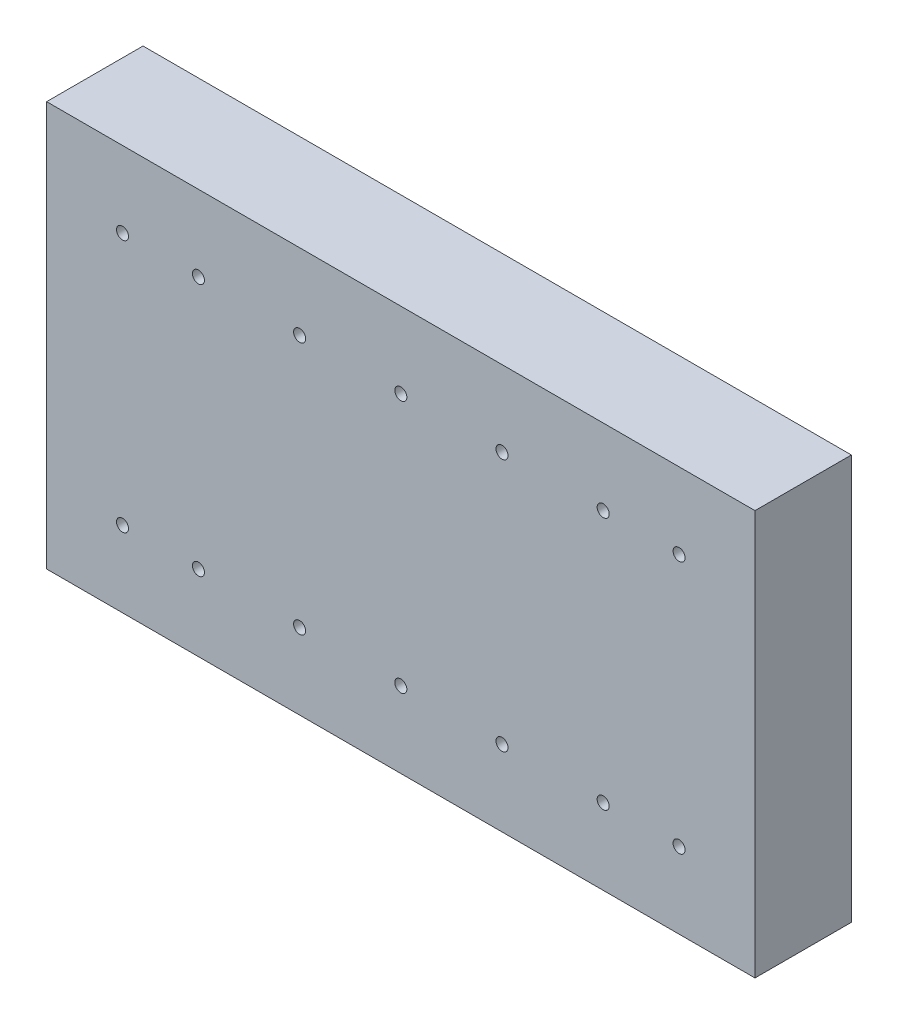
ISO-10303-21;
HEADER;
FILE_DESCRIPTION(('STEP AP214'),'2;1');
FILE_NAME('part.step','',(''),(''),'','','');
FILE_SCHEMA(('AUTOMOTIVE_DESIGN { 1 0 10303 214 1 1 1 1 }'));
ENDSEC;
DATA;
#1=APPLICATION_CONTEXT('core data for automotive mechanical design processes');
#2=APPLICATION_PROTOCOL_DEFINITION('international standard','automotive_design',2000,#1);
#3=PRODUCT_CONTEXT('',#1,'mechanical');
#4=PRODUCT('Part','Part','',(#3));
#5=PRODUCT_RELATED_PRODUCT_CATEGORY('part','',(#4));
#6=PRODUCT_DEFINITION_FORMATION('','',#4);
#7=PRODUCT_DEFINITION_CONTEXT('part definition',#1,'design');
#8=PRODUCT_DEFINITION('design','',#6,#7);
#9=PRODUCT_DEFINITION_SHAPE('','',#8);
#10=(LENGTH_UNIT() NAMED_UNIT(*) SI_UNIT(.MILLI.,.METRE.));
#11=(NAMED_UNIT(*) PLANE_ANGLE_UNIT() SI_UNIT($,.RADIAN.));
#12=(NAMED_UNIT(*) SI_UNIT($,.STERADIAN.) SOLID_ANGLE_UNIT());
#13=UNCERTAINTY_MEASURE_WITH_UNIT(LENGTH_MEASURE(1.E-05),#10,'distance_accuracy_value','');
#14=(GEOMETRIC_REPRESENTATION_CONTEXT(3) GLOBAL_UNCERTAINTY_ASSIGNED_CONTEXT((#13)) GLOBAL_UNIT_ASSIGNED_CONTEXT((#10,
#11,#12)) REPRESENTATION_CONTEXT('',''));
#15=CARTESIAN_POINT('',(0.,0.,0.));
#16=DIRECTION('',(0.,0.,1.));
#17=DIRECTION('',(1.,0.,0.));
#18=AXIS2_PLACEMENT_3D('',#15,#16,#17);
#19=CARTESIAN_POINT('',(70.,0.,22.225));
#20=DIRECTION('',(1.,0.,0.));
#21=DIRECTION('',(0.,1.,0.));
#22=AXIS2_PLACEMENT_3D('',#19,#20,#21);
#23=PLANE('',#22);
#24=DIRECTION('',(0.,-1.,0.));
#25=VECTOR('',#24,1.);
#26=CARTESIAN_POINT('',(70.,-19.9999999999992,12.7));
#27=LINE('',#26,#25);
#28=CARTESIAN_POINT('',(70.,39.9999999999983,12.7));
#29=VERTEX_POINT('',#28);
#30=CARTESIAN_POINT('',(70.,-39.9999999999983,12.7));
#31=VERTEX_POINT('',#30);
#32=EDGE_CURVE('E233',#29,#31,#27,.T.);
#33=ORIENTED_EDGE('',*,*,#32,.F.);
#34=DIRECTION('',(0.,0.,-1.));
#35=VECTOR('',#34,1.);
#36=CARTESIAN_POINT('',(70.,39.9999999999983,17.4625));
#37=LINE('',#36,#35);
#38=CARTESIAN_POINT('',(70.,39.9999999999983,31.75));
#39=VERTEX_POINT('',#38);
#40=EDGE_CURVE('E246',#39,#29,#37,.T.);
#41=ORIENTED_EDGE('',*,*,#40,.F.);
#42=DIRECTION('',(0.,1.,0.));
#43=VECTOR('',#42,1.);
#44=CARTESIAN_POINT('',(70.,19.999999999999,31.7499999999995));
#45=LINE('',#44,#43);
#46=CARTESIAN_POINT('',(70.,-39.9999999999983,31.75));
#47=VERTEX_POINT('',#46);
#48=EDGE_CURVE('E224',#47,#39,#45,.T.);
#49=ORIENTED_EDGE('',*,*,#48,.F.);
#50=DIRECTION('',(0.,0.,1.));
#51=VECTOR('',#50,1.);
#52=CARTESIAN_POINT('',(70.,-39.9999999999983,26.9875));
#53=LINE('',#52,#51);
#54=EDGE_CURVE('E11',#31,#47,#53,.T.);
#55=ORIENTED_EDGE('',*,*,#54,.F.);
#56=EDGE_LOOP('',(#33,#41,#49,#55));
#57=FACE_BOUND('',#56,.T.);
#58=ADVANCED_FACE('F17',(#57),#23,.T.);
#59=CARTESIAN_POINT('',(0.,-39.9999999999983,31.75));
#60=DIRECTION('',(0.,-1.,0.));
#61=DIRECTION('',(-1.,0.,0.));
#62=AXIS2_PLACEMENT_3D('',#59,#60,#61);
#63=PLANE('',#62);
#64=ORIENTED_EDGE('',*,*,#54,.T.);
#65=DIRECTION('',(1.,0.,0.));
#66=VECTOR('',#65,1.);
#67=CARTESIAN_POINT('',(0.,-39.9999999999983,31.75));
#68=LINE('',#67,#66);
#69=CARTESIAN_POINT('',(-70.,-39.9999999999983,31.75));
#70=VERTEX_POINT('',#69);
#71=EDGE_CURVE('E223',#70,#47,#68,.T.);
#72=ORIENTED_EDGE('',*,*,#71,.F.);
#73=DIRECTION('',(0.,0.,-1.));
#74=VECTOR('',#73,1.);
#75=CARTESIAN_POINT('',(-70.,-39.9999999999983,17.4625));
#76=LINE('',#75,#74);
#77=CARTESIAN_POINT('',(-70.,-39.9999999999983,12.7));
#78=VERTEX_POINT('',#77);
#79=EDGE_CURVE('E211',#70,#78,#76,.T.);
#80=ORIENTED_EDGE('',*,*,#79,.T.);
#81=DIRECTION('',(1.,0.,0.));
#82=VECTOR('',#81,1.);
#83=CARTESIAN_POINT('',(0.,-39.9999999999983,12.7));
#84=LINE('',#83,#82);
#85=EDGE_CURVE('E28',#78,#31,#84,.T.);
#86=ORIENTED_EDGE('',*,*,#85,.T.);
#87=EDGE_LOOP('',(#64,#72,#80,#86));
#88=FACE_BOUND('',#87,.T.);
#89=ADVANCED_FACE('F411',(#88),#63,.T.);
#90=CARTESIAN_POINT('',(0.,-39.9999999999983,12.7));
#91=DIRECTION('',(0.,0.,-1.));
#92=DIRECTION('',(0.,-1.,0.));
#93=AXIS2_PLACEMENT_3D('',#90,#91,#92);
#94=PLANE('',#93);
#95=CARTESIAN_POINT('',(40.,24.9999999999984,12.7));
#96=DIRECTION('',(0.,0.,1.));
#97=DIRECTION('',(1.,0.,0.));
#98=AXIS2_PLACEMENT_3D('',#95,#96,#97);
#99=CIRCLE('',#98,1.190625);
#100=CARTESIAN_POINT('',(38.809375,24.9999999999984,12.7));
#101=VERTEX_POINT('',#100);
#102=EDGE_CURVE('E335',#101,#101,#99,.T.);
#103=ORIENTED_EDGE('',*,*,#102,.T.);
#104=EDGE_LOOP('',(#103));
#105=FACE_BOUND('',#104,.T.);
#106=CARTESIAN_POINT('',(0.,24.9999999999983,12.7));
#107=DIRECTION('',(0.,0.,1.));
#108=DIRECTION('',(1.,0.,0.));
#109=AXIS2_PLACEMENT_3D('',#106,#107,#108);
#110=CIRCLE('',#109,1.190625);
#111=CARTESIAN_POINT('',(-1.190625,24.9999999999983,12.7));
#112=VERTEX_POINT('',#111);
#113=EDGE_CURVE('E218',#112,#112,#110,.T.);
#114=ORIENTED_EDGE('',*,*,#113,.T.);
#115=EDGE_LOOP('',(#114));
#116=FACE_BOUND('',#115,.T.);
#117=CARTESIAN_POINT('',(-40.,24.9999999999983,12.7));
#118=DIRECTION('',(0.,0.,1.));
#119=DIRECTION('',(1.,0.,0.));
#120=AXIS2_PLACEMENT_3D('',#117,#118,#119);
#121=CIRCLE('',#120,1.190625);
#122=CARTESIAN_POINT('',(-41.190625,24.9999999999983,12.7));
#123=VERTEX_POINT('',#122);
#124=EDGE_CURVE('E254',#123,#123,#121,.T.);
#125=ORIENTED_EDGE('',*,*,#124,.T.);
#126=EDGE_LOOP('',(#125));
#127=FACE_BOUND('',#126,.T.);
#128=CARTESIAN_POINT('',(-40.,-24.9999999999983,12.7));
#129=DIRECTION('',(0.,0.,1.));
#130=DIRECTION('',(1.,0.,0.));
#131=AXIS2_PLACEMENT_3D('',#128,#129,#130);
#132=CIRCLE('',#131,1.190625);
#133=CARTESIAN_POINT('',(-41.190625,-24.9999999999983,12.7));
#134=VERTEX_POINT('',#133);
#135=EDGE_CURVE('E192',#134,#134,#132,.T.);
#136=ORIENTED_EDGE('',*,*,#135,.T.);
#137=EDGE_LOOP('',(#136));
#138=FACE_BOUND('',#137,.T.);
#139=CARTESIAN_POINT('',(0.,-24.9999999999983,12.7));
#140=DIRECTION('',(0.,0.,1.));
#141=DIRECTION('',(1.,0.,0.));
#142=AXIS2_PLACEMENT_3D('',#139,#140,#141);
#143=CIRCLE('',#142,1.190625);
#144=CARTESIAN_POINT('',(-1.190625,-24.9999999999983,12.7));
#145=VERTEX_POINT('',#144);
#146=EDGE_CURVE('E166',#145,#145,#143,.T.);
#147=ORIENTED_EDGE('',*,*,#146,.T.);
#148=EDGE_LOOP('',(#147));
#149=FACE_BOUND('',#148,.T.);
#150=CARTESIAN_POINT('',(40.,-24.9999999999982,12.7));
#151=DIRECTION('',(0.,0.,1.));
#152=DIRECTION('',(1.,0.,0.));
#153=AXIS2_PLACEMENT_3D('',#150,#151,#152);
#154=CIRCLE('',#153,1.190625);
#155=CARTESIAN_POINT('',(38.809375,-24.9999999999982,12.7));
#156=VERTEX_POINT('',#155);
#157=EDGE_CURVE('E278',#156,#156,#154,.T.);
#158=ORIENTED_EDGE('',*,*,#157,.T.);
#159=EDGE_LOOP('',(#158));
#160=FACE_BOUND('',#159,.T.);
#161=CARTESIAN_POINT('',(55.,-24.9999999999983,12.7));
#162=DIRECTION('',(0.,0.,1.));
#163=DIRECTION('',(-1.,0.,0.));
#164=AXIS2_PLACEMENT_3D('',#161,#162,#163);
#165=CIRCLE('',#164,1.1905);
#166=CARTESIAN_POINT('',(56.1905,-24.9999999999983,12.7));
#167=VERTEX_POINT('',#166);
#168=EDGE_CURVE('E332',#167,#167,#165,.T.);
#169=ORIENTED_EDGE('',*,*,#168,.T.);
#170=EDGE_LOOP('',(#169));
#171=FACE_BOUND('',#170,.T.);
#172=CARTESIAN_POINT('',(20.0000000000074,24.9999999999983,12.7000000000002));
#173=DIRECTION('',(0.,0.,1.));
#174=DIRECTION('',(-1.,0.,0.));
#175=AXIS2_PLACEMENT_3D('',#172,#173,#174);
#176=CIRCLE('',#175,1.1905);
#177=CARTESIAN_POINT('',(21.1905000000074,24.9999999999983,12.7000000000002));
#178=VERTEX_POINT('',#177);
#179=EDGE_CURVE('E301',#178,#178,#176,.T.);
#180=ORIENTED_EDGE('',*,*,#179,.T.);
#181=EDGE_LOOP('',(#180));
#182=FACE_BOUND('',#181,.T.);
#183=CARTESIAN_POINT('',(-20.0000000000074,-24.9999999999983,12.7));
#184=DIRECTION('',(0.,0.,1.));
#185=DIRECTION('',(-1.,0.,0.));
#186=AXIS2_PLACEMENT_3D('',#183,#184,#185);
#187=CIRCLE('',#186,1.1905);
#188=CARTESIAN_POINT('',(-18.8095000000074,-24.9999999999983,12.7));
#189=VERTEX_POINT('',#188);
#190=EDGE_CURVE('E270',#189,#189,#187,.T.);
#191=ORIENTED_EDGE('',*,*,#190,.T.);
#192=EDGE_LOOP('',(#191));
#193=FACE_BOUND('',#192,.T.);
#194=CARTESIAN_POINT('',(-55.,24.9999999999983,12.7000000000002));
#195=DIRECTION('',(0.,0.,1.));
#196=DIRECTION('',(-1.,0.,0.));
#197=AXIS2_PLACEMENT_3D('',#194,#195,#196);
#198=CIRCLE('',#197,1.1905);
#199=CARTESIAN_POINT('',(-53.8095,24.9999999999983,12.7000000000002));
#200=VERTEX_POINT('',#199);
#201=EDGE_CURVE('E229',#200,#200,#198,.T.);
#202=ORIENTED_EDGE('',*,*,#201,.T.);
#203=EDGE_LOOP('',(#202));
#204=FACE_BOUND('',#203,.T.);
#205=CARTESIAN_POINT('',(-55.,-24.9999999999983,12.7));
#206=DIRECTION('',(0.,0.,1.));
#207=DIRECTION('',(-1.,0.,0.));
#208=AXIS2_PLACEMENT_3D('',#205,#206,#207);
#209=CIRCLE('',#208,1.1905);
#210=CARTESIAN_POINT('',(-53.8095,-24.9999999999983,12.7));
#211=VERTEX_POINT('',#210);
#212=EDGE_CURVE('E237',#211,#211,#209,.T.);
#213=ORIENTED_EDGE('',*,*,#212,.T.);
#214=EDGE_LOOP('',(#213));
#215=FACE_BOUND('',#214,.T.);
#216=CARTESIAN_POINT('',(-20.0000000000074,24.9999999999983,12.7000000000002));
#217=DIRECTION('',(0.,0.,1.));
#218=DIRECTION('',(-1.,0.,0.));
#219=AXIS2_PLACEMENT_3D('',#216,#217,#218);
#220=CIRCLE('',#219,1.1905);
#221=CARTESIAN_POINT('',(-18.8095000000074,24.9999999999983,12.7000000000002));
#222=VERTEX_POINT('',#221);
#223=EDGE_CURVE('E255',#222,#222,#220,.T.);
#224=ORIENTED_EDGE('',*,*,#223,.T.);
#225=EDGE_LOOP('',(#224));
#226=FACE_BOUND('',#225,.T.);
#227=CARTESIAN_POINT('',(20.0000000000074,-24.9999999999983,12.7));
#228=DIRECTION('',(0.,0.,1.));
#229=DIRECTION('',(-1.,0.,0.));
#230=AXIS2_PLACEMENT_3D('',#227,#228,#229);
#231=CIRCLE('',#230,1.1905);
#232=CARTESIAN_POINT('',(21.1905000000074,-24.9999999999983,12.7));
#233=VERTEX_POINT('',#232);
#234=EDGE_CURVE('E240',#233,#233,#231,.T.);
#235=ORIENTED_EDGE('',*,*,#234,.T.);
#236=EDGE_LOOP('',(#235));
#237=FACE_BOUND('',#236,.T.);
#238=CARTESIAN_POINT('',(55.,24.9999999999983,12.7000000000002));
#239=DIRECTION('',(0.,0.,1.));
#240=DIRECTION('',(-1.,0.,0.));
#241=AXIS2_PLACEMENT_3D('',#238,#239,#240);
#242=CIRCLE('',#241,1.1905);
#243=CARTESIAN_POINT('',(56.1905,24.9999999999983,12.7000000000002));
#244=VERTEX_POINT('',#243);
#245=EDGE_CURVE('E394',#244,#244,#242,.T.);
#246=ORIENTED_EDGE('',*,*,#245,.T.);
#247=EDGE_LOOP('',(#246));
#248=FACE_BOUND('',#247,.T.);
#249=ORIENTED_EDGE('',*,*,#32,.T.);
#250=ORIENTED_EDGE('',*,*,#85,.F.);
#251=DIRECTION('',(0.,1.,0.));
#252=VECTOR('',#251,1.);
#253=CARTESIAN_POINT('',(-70.,19.9999999999991,12.7));
#254=LINE('',#253,#252);
#255=CARTESIAN_POINT('',(-70.,39.9999999999983,12.7));
#256=VERTEX_POINT('',#255);
#257=EDGE_CURVE('E313',#78,#256,#254,.T.);
#258=ORIENTED_EDGE('',*,*,#257,.T.);
#259=DIRECTION('',(-1.,0.,0.));
#260=VECTOR('',#259,1.);
#261=CARTESIAN_POINT('',(0.,39.9999999999983,12.7));
#262=LINE('',#261,#260);
#263=EDGE_CURVE('E249',#29,#256,#262,.T.);
#264=ORIENTED_EDGE('',*,*,#263,.F.);
#265=EDGE_LOOP('',(#249,#250,#258,#264));
#266=FACE_BOUND('',#265,.T.);
#267=ADVANCED_FACE('F193',(#105,#116,#127,#138,#149,#160,#171,#182,#193,#204,#215,#226,#237,
#248,#266),#94,.T.);
#268=CARTESIAN_POINT('',(0.,39.9999999999983,12.7));
#269=DIRECTION('',(0.,1.,0.));
#270=DIRECTION('',(1.,0.,0.));
#271=AXIS2_PLACEMENT_3D('',#268,#269,#270);
#272=PLANE('',#271);
#273=ORIENTED_EDGE('',*,*,#40,.T.);
#274=ORIENTED_EDGE('',*,*,#263,.T.);
#275=DIRECTION('',(0.,0.,1.));
#276=VECTOR('',#275,1.);
#277=CARTESIAN_POINT('',(-70.,39.9999999999983,26.9875));
#278=LINE('',#277,#276);
#279=CARTESIAN_POINT('',(-70.,39.9999999999983,31.75));
#280=VERTEX_POINT('',#279);
#281=EDGE_CURVE('E309',#256,#280,#278,.T.);
#282=ORIENTED_EDGE('',*,*,#281,.T.);
#283=DIRECTION('',(1.,0.,0.));
#284=VECTOR('',#283,1.);
#285=CARTESIAN_POINT('',(0.,39.9999999999983,31.75));
#286=LINE('',#285,#284);
#287=EDGE_CURVE('E219',#280,#39,#286,.T.);
#288=ORIENTED_EDGE('',*,*,#287,.T.);
#289=EDGE_LOOP('',(#273,#274,#282,#288));
#290=FACE_BOUND('',#289,.T.);
#291=ADVANCED_FACE('F410',(#290),#272,.T.);
#292=CARTESIAN_POINT('',(0.,39.9999999999983,31.75));
#293=DIRECTION('',(0.,0.,1.));
#294=DIRECTION('',(0.,-1.,0.));
#295=AXIS2_PLACEMENT_3D('',#292,#293,#294);
#296=PLANE('',#295);
#297=CARTESIAN_POINT('',(40.,24.9999999999984,31.75));
#298=DIRECTION('',(0.,0.,-1.));
#299=DIRECTION('',(1.,0.,0.));
#300=AXIS2_PLACEMENT_3D('',#297,#298,#299);
#301=CIRCLE('',#300,1.190625);
#302=CARTESIAN_POINT('',(38.809375,24.9999999999984,31.75));
#303=VERTEX_POINT('',#302);
#304=EDGE_CURVE('E213',#303,#303,#301,.T.);
#305=ORIENTED_EDGE('',*,*,#304,.T.);
#306=EDGE_LOOP('',(#305));
#307=FACE_BOUND('',#306,.T.);
#308=CARTESIAN_POINT('',(0.,24.9999999999984,31.75));
#309=DIRECTION('',(0.,0.,-1.));
#310=DIRECTION('',(1.,0.,0.));
#311=AXIS2_PLACEMENT_3D('',#308,#309,#310);
#312=CIRCLE('',#311,1.190625);
#313=CARTESIAN_POINT('',(-1.190625,24.9999999999984,31.75));
#314=VERTEX_POINT('',#313);
#315=EDGE_CURVE('E375',#314,#314,#312,.T.);
#316=ORIENTED_EDGE('',*,*,#315,.T.);
#317=EDGE_LOOP('',(#316));
#318=FACE_BOUND('',#317,.T.);
#319=CARTESIAN_POINT('',(-40.,24.9999999999984,31.75));
#320=DIRECTION('',(0.,0.,-1.));
#321=DIRECTION('',(1.,0.,0.));
#322=AXIS2_PLACEMENT_3D('',#319,#320,#321);
#323=CIRCLE('',#322,1.190625);
#324=CARTESIAN_POINT('',(-41.190625,24.9999999999984,31.75));
#325=VERTEX_POINT('',#324);
#326=EDGE_CURVE('E197',#325,#325,#323,.T.);
#327=ORIENTED_EDGE('',*,*,#326,.T.);
#328=EDGE_LOOP('',(#327));
#329=FACE_BOUND('',#328,.T.);
#330=CARTESIAN_POINT('',(-40.,-24.9999999999982,31.75));
#331=DIRECTION('',(0.,0.,-1.));
#332=DIRECTION('',(1.,0.,0.));
#333=AXIS2_PLACEMENT_3D('',#330,#331,#332);
#334=CIRCLE('',#333,1.190625);
#335=CARTESIAN_POINT('',(-41.190625,-24.9999999999982,31.75));
#336=VERTEX_POINT('',#335);
#337=EDGE_CURVE('E21',#336,#336,#334,.T.);
#338=ORIENTED_EDGE('',*,*,#337,.T.);
#339=EDGE_LOOP('',(#338));
#340=FACE_BOUND('',#339,.T.);
#341=CARTESIAN_POINT('',(0.,-24.9999999999982,31.75));
#342=DIRECTION('',(0.,0.,-1.));
#343=DIRECTION('',(1.,0.,0.));
#344=AXIS2_PLACEMENT_3D('',#341,#342,#343);
#345=CIRCLE('',#344,1.190625);
#346=CARTESIAN_POINT('',(-1.190625,-24.9999999999982,31.75));
#347=VERTEX_POINT('',#346);
#348=EDGE_CURVE('E275',#347,#347,#345,.T.);
#349=ORIENTED_EDGE('',*,*,#348,.T.);
#350=EDGE_LOOP('',(#349));
#351=FACE_BOUND('',#350,.T.);
#352=CARTESIAN_POINT('',(40.,-24.9999999999982,31.75));
#353=DIRECTION('',(0.,0.,-1.));
#354=DIRECTION('',(1.,0.,0.));
#355=AXIS2_PLACEMENT_3D('',#352,#353,#354);
#356=CIRCLE('',#355,1.190625);
#357=CARTESIAN_POINT('',(38.809375,-24.9999999999982,31.75));
#358=VERTEX_POINT('',#357);
#359=EDGE_CURVE('E321',#358,#358,#356,.T.);
#360=ORIENTED_EDGE('',*,*,#359,.T.);
#361=EDGE_LOOP('',(#360));
#362=FACE_BOUND('',#361,.T.);
#363=CARTESIAN_POINT('',(55.,-24.9999999999983,31.75));
#364=DIRECTION('',(0.,0.,-1.));
#365=DIRECTION('',(-1.,0.,0.));
#366=AXIS2_PLACEMENT_3D('',#363,#364,#365);
#367=CIRCLE('',#366,1.1905);
#368=CARTESIAN_POINT('',(56.1905,-24.9999999999983,31.75));
#369=VERTEX_POINT('',#368);
#370=EDGE_CURVE('E326',#369,#369,#367,.T.);
#371=ORIENTED_EDGE('',*,*,#370,.T.);
#372=EDGE_LOOP('',(#371));
#373=FACE_BOUND('',#372,.T.);
#374=CARTESIAN_POINT('',(20.0000000000074,24.9999999999983,31.75));
#375=DIRECTION('',(0.,0.,-1.));
#376=DIRECTION('',(-1.,0.,0.));
#377=AXIS2_PLACEMENT_3D('',#374,#375,#376);
#378=CIRCLE('',#377,1.1905);
#379=CARTESIAN_POINT('',(21.1905000000074,24.9999999999983,31.75));
#380=VERTEX_POINT('',#379);
#381=EDGE_CURVE('E117',#380,#380,#378,.T.);
#382=ORIENTED_EDGE('',*,*,#381,.T.);
#383=EDGE_LOOP('',(#382));
#384=FACE_BOUND('',#383,.T.);
#385=CARTESIAN_POINT('',(-20.0000000000074,-24.9999999999983,31.75));
#386=DIRECTION('',(0.,0.,-1.));
#387=DIRECTION('',(-1.,0.,0.));
#388=AXIS2_PLACEMENT_3D('',#385,#386,#387);
#389=CIRCLE('',#388,1.1905);
#390=CARTESIAN_POINT('',(-18.8095000000074,-24.9999999999983,31.75));
#391=VERTEX_POINT('',#390);
#392=EDGE_CURVE('E306',#391,#391,#389,.T.);
#393=ORIENTED_EDGE('',*,*,#392,.T.);
#394=EDGE_LOOP('',(#393));
#395=FACE_BOUND('',#394,.T.);
#396=CARTESIAN_POINT('',(-55.,24.9999999999983,31.75));
#397=DIRECTION('',(0.,0.,-1.));
#398=DIRECTION('',(-1.,0.,0.));
#399=AXIS2_PLACEMENT_3D('',#396,#397,#398);
#400=CIRCLE('',#399,1.1905);
#401=CARTESIAN_POINT('',(-53.8095,24.9999999999983,31.75));
#402=VERTEX_POINT('',#401);
#403=EDGE_CURVE('E228',#402,#402,#400,.T.);
#404=ORIENTED_EDGE('',*,*,#403,.T.);
#405=EDGE_LOOP('',(#404));
#406=FACE_BOUND('',#405,.T.);
#407=CARTESIAN_POINT('',(-55.,-24.9999999999983,31.75));
#408=DIRECTION('',(0.,0.,-1.));
#409=DIRECTION('',(-1.,0.,0.));
#410=AXIS2_PLACEMENT_3D('',#407,#408,#409);
#411=CIRCLE('',#410,1.1905);
#412=CARTESIAN_POINT('',(-53.8095,-24.9999999999983,31.75));
#413=VERTEX_POINT('',#412);
#414=EDGE_CURVE('E269',#413,#413,#411,.T.);
#415=ORIENTED_EDGE('',*,*,#414,.T.);
#416=EDGE_LOOP('',(#415));
#417=FACE_BOUND('',#416,.T.);
#418=CARTESIAN_POINT('',(-20.0000000000074,24.9999999999983,31.75));
#419=DIRECTION('',(0.,0.,-1.));
#420=DIRECTION('',(-1.,0.,0.));
#421=AXIS2_PLACEMENT_3D('',#418,#419,#420);
#422=CIRCLE('',#421,1.1905);
#423=CARTESIAN_POINT('',(-18.8095000000074,24.9999999999983,31.75));
#424=VERTEX_POINT('',#423);
#425=EDGE_CURVE('E234',#424,#424,#422,.T.);
#426=ORIENTED_EDGE('',*,*,#425,.T.);
#427=EDGE_LOOP('',(#426));
#428=FACE_BOUND('',#427,.T.);
#429=CARTESIAN_POINT('',(20.0000000000074,-24.9999999999983,31.75));
#430=DIRECTION('',(0.,0.,-1.));
#431=DIRECTION('',(-1.,0.,0.));
#432=AXIS2_PLACEMENT_3D('',#429,#430,#431);
#433=CIRCLE('',#432,1.1905);
#434=CARTESIAN_POINT('',(21.1905000000074,-24.9999999999983,31.75));
#435=VERTEX_POINT('',#434);
#436=EDGE_CURVE('E259',#435,#435,#433,.T.);
#437=ORIENTED_EDGE('',*,*,#436,.T.);
#438=EDGE_LOOP('',(#437));
#439=FACE_BOUND('',#438,.T.);
#440=CARTESIAN_POINT('',(55.,24.9999999999983,31.75));
#441=DIRECTION('',(0.,0.,-1.));
#442=DIRECTION('',(-1.,0.,0.));
#443=AXIS2_PLACEMENT_3D('',#440,#441,#442);
#444=CIRCLE('',#443,1.1905);
#445=CARTESIAN_POINT('',(56.1905,24.9999999999983,31.75));
#446=VERTEX_POINT('',#445);
#447=EDGE_CURVE('E245',#446,#446,#444,.T.);
#448=ORIENTED_EDGE('',*,*,#447,.T.);
#449=EDGE_LOOP('',(#448));
#450=FACE_BOUND('',#449,.T.);
#451=ORIENTED_EDGE('',*,*,#48,.T.);
#452=ORIENTED_EDGE('',*,*,#287,.F.);
#453=DIRECTION('',(0.,-1.,0.));
#454=VECTOR('',#453,1.);
#455=CARTESIAN_POINT('',(-70.,-19.9999999999993,31.7499999999983));
#456=LINE('',#455,#454);
#457=EDGE_CURVE('E314',#280,#70,#456,.T.);
#458=ORIENTED_EDGE('',*,*,#457,.T.);
#459=ORIENTED_EDGE('',*,*,#71,.T.);
#460=EDGE_LOOP('',(#451,#452,#458,#459));
#461=FACE_BOUND('',#460,.T.);
#462=ADVANCED_FACE('F402',(#307,#318,#329,#340,#351,#362,#373,#384,#395,#406,#417,#428,#439,
#450,#461),#296,.T.);
#463=CARTESIAN_POINT('',(-70.,0.,22.225));
#464=DIRECTION('',(-1.,0.,0.));
#465=DIRECTION('',(0.,0.,1.));
#466=AXIS2_PLACEMENT_3D('',#463,#464,#465);
#467=PLANE('',#466);
#468=ORIENTED_EDGE('',*,*,#457,.F.);
#469=ORIENTED_EDGE('',*,*,#281,.F.);
#470=ORIENTED_EDGE('',*,*,#257,.F.);
#471=ORIENTED_EDGE('',*,*,#79,.F.);
#472=EDGE_LOOP('',(#468,#469,#470,#471));
#473=FACE_BOUND('',#472,.T.);
#474=ADVANCED_FACE('F420',(#473),#467,.T.);
#475=CARTESIAN_POINT('',(40.,24.9999999999984,31.4325));
#476=DIRECTION('',(0.,0.,-1.));
#477=DIRECTION('',(1.,0.,0.));
#478=AXIS2_PLACEMENT_3D('',#475,#476,#477);
#479=CYLINDRICAL_SURFACE('',#478,1.190625);
#480=ORIENTED_EDGE('',*,*,#304,.F.);
#481=DIRECTION('',(0.,0.,-1.));
#482=VECTOR('',#481,1.);
#483=CARTESIAN_POINT('',(38.809375,24.9999999999984,31.4325));
#484=LINE('',#483,#482);
#485=EDGE_CURVE('E217',#303,#101,#484,.T.);
#486=ORIENTED_EDGE('',*,*,#485,.T.);
#487=ORIENTED_EDGE('',*,*,#102,.F.);
#488=ORIENTED_EDGE('',*,*,#485,.F.);
#489=EDGE_LOOP('',(#480,#486,#487,#488));
#490=FACE_BOUND('',#489,.T.);
#491=ADVANCED_FACE('F485',(#490),#479,.F.);
#492=CARTESIAN_POINT('',(0.,24.9999999999984,31.4325));
#493=DIRECTION('',(0.,0.,-1.));
#494=DIRECTION('',(1.,0.,0.));
#495=AXIS2_PLACEMENT_3D('',#492,#493,#494);
#496=CYLINDRICAL_SURFACE('',#495,1.190625);
#497=ORIENTED_EDGE('',*,*,#315,.F.);
#498=DIRECTION('',(0.,0.,-1.));
#499=VECTOR('',#498,1.);
#500=CARTESIAN_POINT('',(-1.190625,24.9999999999984,31.4325));
#501=LINE('',#500,#499);
#502=EDGE_CURVE('E262',#314,#112,#501,.T.);
#503=ORIENTED_EDGE('',*,*,#502,.T.);
#504=ORIENTED_EDGE('',*,*,#113,.F.);
#505=ORIENTED_EDGE('',*,*,#502,.F.);
#506=EDGE_LOOP('',(#497,#503,#504,#505));
#507=FACE_BOUND('',#506,.T.);
#508=ADVANCED_FACE('F405',(#507),#496,.F.);
#509=CARTESIAN_POINT('',(-40.,24.9999999999984,31.4325));
#510=DIRECTION('',(0.,0.,-1.));
#511=DIRECTION('',(1.,0.,0.));
#512=AXIS2_PLACEMENT_3D('',#509,#510,#511);
#513=CYLINDRICAL_SURFACE('',#512,1.190625);
#514=ORIENTED_EDGE('',*,*,#326,.F.);
#515=DIRECTION('',(0.,0.,-1.));
#516=VECTOR('',#515,1.);
#517=CARTESIAN_POINT('',(-41.190625,24.9999999999984,31.4325));
#518=LINE('',#517,#516);
#519=EDGE_CURVE('E206',#325,#123,#518,.T.);
#520=ORIENTED_EDGE('',*,*,#519,.T.);
#521=ORIENTED_EDGE('',*,*,#124,.F.);
#522=ORIENTED_EDGE('',*,*,#519,.F.);
#523=EDGE_LOOP('',(#514,#520,#521,#522));
#524=FACE_BOUND('',#523,.T.);
#525=ADVANCED_FACE('F417',(#524),#513,.F.);
#526=CARTESIAN_POINT('',(-40.,-24.9999999999982,31.4325));
#527=DIRECTION('',(0.,0.,-1.));
#528=DIRECTION('',(1.,0.,0.));
#529=AXIS2_PLACEMENT_3D('',#526,#527,#528);
#530=CYLINDRICAL_SURFACE('',#529,1.190625);
#531=ORIENTED_EDGE('',*,*,#337,.F.);
#532=DIRECTION('',(0.,0.,-1.));
#533=VECTOR('',#532,1.);
#534=CARTESIAN_POINT('',(-41.190625,-24.9999999999982,31.4325));
#535=LINE('',#534,#533);
#536=EDGE_CURVE('E198',#336,#134,#535,.T.);
#537=ORIENTED_EDGE('',*,*,#536,.T.);
#538=ORIENTED_EDGE('',*,*,#135,.F.);
#539=ORIENTED_EDGE('',*,*,#536,.F.);
#540=EDGE_LOOP('',(#531,#537,#538,#539));
#541=FACE_BOUND('',#540,.T.);
#542=ADVANCED_FACE('F470',(#541),#530,.F.);
#543=CARTESIAN_POINT('',(0.,-24.9999999999982,31.4325));
#544=DIRECTION('',(0.,0.,-1.));
#545=DIRECTION('',(1.,0.,0.));
#546=AXIS2_PLACEMENT_3D('',#543,#544,#545);
#547=CYLINDRICAL_SURFACE('',#546,1.190625);
#548=ORIENTED_EDGE('',*,*,#348,.F.);
#549=DIRECTION('',(0.,0.,-1.));
#550=VECTOR('',#549,1.);
#551=CARTESIAN_POINT('',(-1.190625,-24.9999999999982,31.4325));
#552=LINE('',#551,#550);
#553=EDGE_CURVE('E179',#347,#145,#552,.T.);
#554=ORIENTED_EDGE('',*,*,#553,.T.);
#555=ORIENTED_EDGE('',*,*,#146,.F.);
#556=ORIENTED_EDGE('',*,*,#553,.F.);
#557=EDGE_LOOP('',(#548,#554,#555,#556));
#558=FACE_BOUND('',#557,.T.);
#559=ADVANCED_FACE('F460',(#558),#547,.F.);
#560=CARTESIAN_POINT('',(40.,-24.9999999999982,31.4325));
#561=DIRECTION('',(0.,0.,-1.));
#562=DIRECTION('',(1.,0.,0.));
#563=AXIS2_PLACEMENT_3D('',#560,#561,#562);
#564=CYLINDRICAL_SURFACE('',#563,1.190625);
#565=ORIENTED_EDGE('',*,*,#359,.F.);
#566=DIRECTION('',(0.,0.,-1.));
#567=VECTOR('',#566,1.);
#568=CARTESIAN_POINT('',(38.809375,-24.9999999999982,31.4325));
#569=LINE('',#568,#567);
#570=EDGE_CURVE('E325',#358,#156,#569,.T.);
#571=ORIENTED_EDGE('',*,*,#570,.T.);
#572=ORIENTED_EDGE('',*,*,#157,.F.);
#573=ORIENTED_EDGE('',*,*,#570,.F.);
#574=EDGE_LOOP('',(#565,#571,#572,#573));
#575=FACE_BOUND('',#574,.T.);
#576=ADVANCED_FACE('F457',(#575),#564,.F.);
#577=CARTESIAN_POINT('',(55.,-24.9999999999983,38.4175));
#578=DIRECTION('',(0.,0.,1.));
#579=DIRECTION('',(-1.,0.,0.));
#580=AXIS2_PLACEMENT_3D('',#577,#578,#579);
#581=CYLINDRICAL_SURFACE('',#580,1.1905);
#582=ORIENTED_EDGE('',*,*,#168,.F.);
#583=DIRECTION('',(0.,0.,1.));
#584=VECTOR('',#583,1.);
#585=CARTESIAN_POINT('',(56.1905,-24.9999999999983,38.4175));
#586=LINE('',#585,#584);
#587=EDGE_CURVE('E103',#167,#369,#586,.T.);
#588=ORIENTED_EDGE('',*,*,#587,.T.);
#589=ORIENTED_EDGE('',*,*,#370,.F.);
#590=ORIENTED_EDGE('',*,*,#587,.F.);
#591=EDGE_LOOP('',(#582,#588,#589,#590));
#592=FACE_BOUND('',#591,.T.);
#593=ADVANCED_FACE('F459',(#592),#581,.F.);
#594=CARTESIAN_POINT('',(20.0000000000074,24.9999999999983,38.4175));
#595=DIRECTION('',(0.,0.,1.));
#596=DIRECTION('',(-1.,0.,0.));
#597=AXIS2_PLACEMENT_3D('',#594,#595,#596);
#598=CYLINDRICAL_SURFACE('',#597,1.1905);
#599=ORIENTED_EDGE('',*,*,#179,.F.);
#600=DIRECTION('',(0.,0.,1.));
#601=VECTOR('',#600,1.);
#602=CARTESIAN_POINT('',(21.1905000000074,24.9999999999983,38.4175));
#603=LINE('',#602,#601);
#604=EDGE_CURVE('E315',#178,#380,#603,.T.);
#605=ORIENTED_EDGE('',*,*,#604,.T.);
#606=ORIENTED_EDGE('',*,*,#381,.F.);
#607=ORIENTED_EDGE('',*,*,#604,.F.);
#608=EDGE_LOOP('',(#599,#605,#606,#607));
#609=FACE_BOUND('',#608,.T.);
#610=ADVANCED_FACE('F468',(#609),#598,.F.);
#611=CARTESIAN_POINT('',(-20.0000000000074,-24.9999999999984,38.4175));
#612=DIRECTION('',(0.,0.,1.));
#613=DIRECTION('',(-1.,0.,0.));
#614=AXIS2_PLACEMENT_3D('',#611,#612,#613);
#615=CYLINDRICAL_SURFACE('',#614,1.1905);
#616=ORIENTED_EDGE('',*,*,#190,.F.);
#617=DIRECTION('',(0.,0.,1.));
#618=VECTOR('',#617,1.);
#619=CARTESIAN_POINT('',(-18.8095000000074,-24.9999999999984,38.4175));
#620=LINE('',#619,#618);
#621=EDGE_CURVE('E274',#189,#391,#620,.T.);
#622=ORIENTED_EDGE('',*,*,#621,.T.);
#623=ORIENTED_EDGE('',*,*,#392,.F.);
#624=ORIENTED_EDGE('',*,*,#621,.F.);
#625=EDGE_LOOP('',(#616,#622,#623,#624));
#626=FACE_BOUND('',#625,.T.);
#627=ADVANCED_FACE('F489',(#626),#615,.F.);
#628=CARTESIAN_POINT('',(-55.,24.9999999999983,38.4175));
#629=DIRECTION('',(0.,0.,1.));
#630=DIRECTION('',(-1.,0.,0.));
#631=AXIS2_PLACEMENT_3D('',#628,#629,#630);
#632=CYLINDRICAL_SURFACE('',#631,1.1905);
#633=ORIENTED_EDGE('',*,*,#201,.F.);
#634=DIRECTION('',(0.,0.,1.));
#635=VECTOR('',#634,1.);
#636=CARTESIAN_POINT('',(-53.8095,24.9999999999983,38.4175));
#637=LINE('',#636,#635);
#638=EDGE_CURVE('E225',#200,#402,#637,.T.);
#639=ORIENTED_EDGE('',*,*,#638,.T.);
#640=ORIENTED_EDGE('',*,*,#403,.F.);
#641=ORIENTED_EDGE('',*,*,#638,.F.);
#642=EDGE_LOOP('',(#633,#639,#640,#641));
#643=FACE_BOUND('',#642,.T.);
#644=ADVANCED_FACE('F19',(#643),#632,.F.);
#645=CARTESIAN_POINT('',(-55.,-24.9999999999983,38.4175));
#646=DIRECTION('',(0.,0.,1.));
#647=DIRECTION('',(-1.,0.,0.));
#648=AXIS2_PLACEMENT_3D('',#645,#646,#647);
#649=CYLINDRICAL_SURFACE('',#648,1.1905);
#650=ORIENTED_EDGE('',*,*,#212,.F.);
#651=DIRECTION('',(0.,0.,1.));
#652=VECTOR('',#651,1.);
#653=CARTESIAN_POINT('',(-53.8095,-24.9999999999983,38.4175));
#654=LINE('',#653,#652);
#655=EDGE_CURVE('E265',#211,#413,#654,.T.);
#656=ORIENTED_EDGE('',*,*,#655,.T.);
#657=ORIENTED_EDGE('',*,*,#414,.F.);
#658=ORIENTED_EDGE('',*,*,#655,.F.);
#659=EDGE_LOOP('',(#650,#656,#657,#658));
#660=FACE_BOUND('',#659,.T.);
#661=ADVANCED_FACE('F289',(#660),#649,.F.);
#662=CARTESIAN_POINT('',(-20.0000000000074,24.9999999999983,38.4175));
#663=DIRECTION('',(0.,0.,1.));
#664=DIRECTION('',(-1.,0.,0.));
#665=AXIS2_PLACEMENT_3D('',#662,#663,#664);
#666=CYLINDRICAL_SURFACE('',#665,1.1905);
#667=ORIENTED_EDGE('',*,*,#223,.F.);
#668=DIRECTION('',(0.,0.,1.));
#669=VECTOR('',#668,1.);
#670=CARTESIAN_POINT('',(-18.8095000000074,24.9999999999983,38.4175));
#671=LINE('',#670,#669);
#672=EDGE_CURVE('E238',#222,#424,#671,.T.);
#673=ORIENTED_EDGE('',*,*,#672,.T.);
#674=ORIENTED_EDGE('',*,*,#425,.F.);
#675=ORIENTED_EDGE('',*,*,#672,.F.);
#676=EDGE_LOOP('',(#667,#673,#674,#675));
#677=FACE_BOUND('',#676,.T.);
#678=ADVANCED_FACE('F672',(#677),#666,.F.);
#679=CARTESIAN_POINT('',(20.0000000000074,-24.9999999999983,38.4175));
#680=DIRECTION('',(0.,0.,1.));
#681=DIRECTION('',(-1.,0.,0.));
#682=AXIS2_PLACEMENT_3D('',#679,#680,#681);
#683=CYLINDRICAL_SURFACE('',#682,1.1905);
#684=ORIENTED_EDGE('',*,*,#234,.F.);
#685=DIRECTION('',(0.,0.,1.));
#686=VECTOR('',#685,1.);
#687=CARTESIAN_POINT('',(21.1905000000074,-24.9999999999983,38.4175));
#688=LINE('',#687,#686);
#689=EDGE_CURVE('E244',#233,#435,#688,.T.);
#690=ORIENTED_EDGE('',*,*,#689,.T.);
#691=ORIENTED_EDGE('',*,*,#436,.F.);
#692=ORIENTED_EDGE('',*,*,#689,.F.);
#693=EDGE_LOOP('',(#684,#690,#691,#692));
#694=FACE_BOUND('',#693,.T.);
#695=ADVANCED_FACE('F667',(#694),#683,.F.);
#696=CARTESIAN_POINT('',(55.,24.9999999999983,38.4175));
#697=DIRECTION('',(0.,0.,1.));
#698=DIRECTION('',(-1.,0.,0.));
#699=AXIS2_PLACEMENT_3D('',#696,#697,#698);
#700=CYLINDRICAL_SURFACE('',#699,1.1905);
#701=ORIENTED_EDGE('',*,*,#245,.F.);
#702=DIRECTION('',(0.,0.,1.));
#703=VECTOR('',#702,1.);
#704=CARTESIAN_POINT('',(56.1905,24.9999999999983,38.4175));
#705=LINE('',#704,#703);
#706=EDGE_CURVE('E280',#244,#446,#705,.T.);
#707=ORIENTED_EDGE('',*,*,#706,.T.);
#708=ORIENTED_EDGE('',*,*,#447,.F.);
#709=ORIENTED_EDGE('',*,*,#706,.F.);
#710=EDGE_LOOP('',(#701,#707,#708,#709));
#711=FACE_BOUND('',#710,.T.);
#712=ADVANCED_FACE('F441',(#711),#700,.F.);
#713=CLOSED_SHELL('',(#58,#89,#267,#291,#462,#474,#491,#508,#525,#542,#559,#576,#593,#610,#627,
#644,#661,#678,#695,#712));
#714=MANIFOLD_SOLID_BREP('B1',#713);
#715=ADVANCED_BREP_SHAPE_REPRESENTATION('',(#18,#714),#14);
#716=SHAPE_DEFINITION_REPRESENTATION(#9,#715);
ENDSEC;
END-ISO-10303-21;
